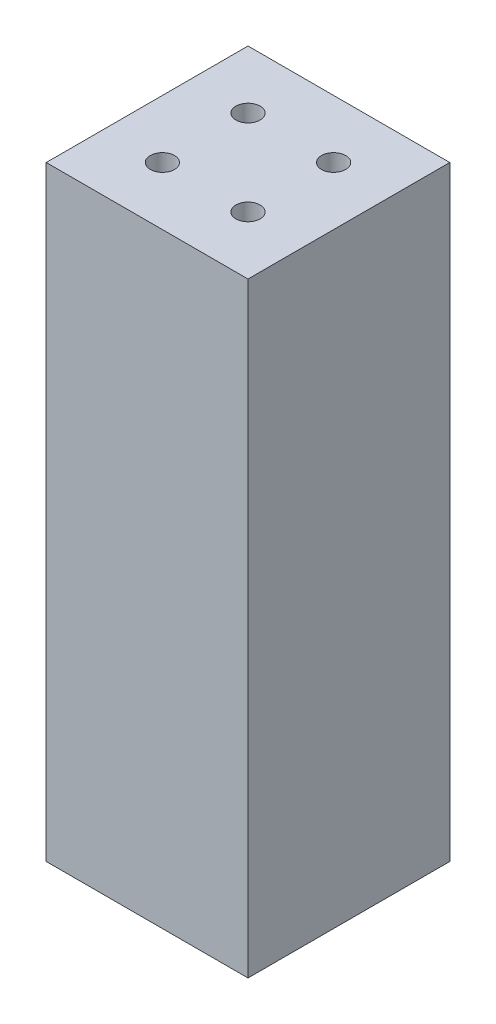
ISO-10303-21;
HEADER;
FILE_DESCRIPTION(('STEP AP214'),'2;1');
FILE_NAME('part.step','',(''),(''),'','','');
FILE_SCHEMA(('AUTOMOTIVE_DESIGN { 1 0 10303 214 1 1 1 1 }'));
ENDSEC;
DATA;
#1=APPLICATION_CONTEXT('core data for automotive mechanical design processes');
#2=APPLICATION_PROTOCOL_DEFINITION('international standard','automotive_design',2000,#1);
#3=PRODUCT_CONTEXT('',#1,'mechanical');
#4=PRODUCT('Part','Part','',(#3));
#5=PRODUCT_RELATED_PRODUCT_CATEGORY('part','',(#4));
#6=PRODUCT_DEFINITION_FORMATION('','',#4);
#7=PRODUCT_DEFINITION_CONTEXT('part definition',#1,'design');
#8=PRODUCT_DEFINITION('design','',#6,#7);
#9=PRODUCT_DEFINITION_SHAPE('','',#8);
#10=(LENGTH_UNIT() NAMED_UNIT(*) SI_UNIT(.MILLI.,.METRE.));
#11=(NAMED_UNIT(*) PLANE_ANGLE_UNIT() SI_UNIT($,.RADIAN.));
#12=(NAMED_UNIT(*) SI_UNIT($,.STERADIAN.) SOLID_ANGLE_UNIT());
#13=UNCERTAINTY_MEASURE_WITH_UNIT(LENGTH_MEASURE(1.E-05),#10,'distance_accuracy_value','');
#14=(GEOMETRIC_REPRESENTATION_CONTEXT(3) GLOBAL_UNCERTAINTY_ASSIGNED_CONTEXT((#13)) GLOBAL_UNIT_ASSIGNED_CONTEXT((#10,
#11,#12)) REPRESENTATION_CONTEXT('',''));
#15=CARTESIAN_POINT('',(0.,0.,0.));
#16=DIRECTION('',(0.,0.,1.));
#17=DIRECTION('',(1.,0.,0.));
#18=AXIS2_PLACEMENT_3D('',#15,#16,#17);
#19=CARTESIAN_POINT('',(-12.5,75.,-12.5));
#20=DIRECTION('',(1.,0.,0.));
#21=DIRECTION('',(0.,0.,-1.));
#22=AXIS2_PLACEMENT_3D('',#19,#20,#21);
#23=PLANE('',#22);
#24=DIRECTION('',(0.,0.,1.));
#25=VECTOR('',#24,1.);
#26=CARTESIAN_POINT('',(-12.5,0.,-12.5));
#27=LINE('',#26,#25);
#28=CARTESIAN_POINT('',(-12.5,0.,-12.5));
#29=VERTEX_POINT('',#28);
#30=CARTESIAN_POINT('',(-12.5,0.,12.5));
#31=VERTEX_POINT('',#30);
#32=EDGE_CURVE('E134',#29,#31,#27,.T.);
#33=ORIENTED_EDGE('',*,*,#32,.T.);
#34=DIRECTION('',(0.,-1.,0.));
#35=VECTOR('',#34,1.);
#36=CARTESIAN_POINT('',(-12.5,75.,12.5));
#37=LINE('',#36,#35);
#38=CARTESIAN_POINT('',(-12.5,75.,12.5));
#39=VERTEX_POINT('',#38);
#40=EDGE_CURVE('E11',#39,#31,#37,.T.);
#41=ORIENTED_EDGE('',*,*,#40,.F.);
#42=DIRECTION('',(0.,0.,1.));
#43=VECTOR('',#42,1.);
#44=CARTESIAN_POINT('',(-12.5,75.,-12.5));
#45=LINE('',#44,#43);
#46=CARTESIAN_POINT('',(-12.5,75.,-12.5));
#47=VERTEX_POINT('',#46);
#48=EDGE_CURVE('E135',#47,#39,#45,.T.);
#49=ORIENTED_EDGE('',*,*,#48,.F.);
#50=DIRECTION('',(0.,-1.,0.));
#51=VECTOR('',#50,1.);
#52=CARTESIAN_POINT('',(-12.5,75.,-12.5));
#53=LINE('',#52,#51);
#54=EDGE_CURVE('E141',#47,#29,#53,.T.);
#55=ORIENTED_EDGE('',*,*,#54,.T.);
#56=EDGE_LOOP('',(#33,#41,#49,#55));
#57=FACE_BOUND('',#56,.T.);
#58=ADVANCED_FACE('F41',(#57),#23,.F.);
#59=CARTESIAN_POINT('',(12.5,75.,12.5));
#60=DIRECTION('',(0.,0.,-1.));
#61=DIRECTION('',(-1.,0.,0.));
#62=AXIS2_PLACEMENT_3D('',#59,#60,#61);
#63=PLANE('',#62);
#64=DIRECTION('',(1.,0.,0.));
#65=VECTOR('',#64,1.);
#66=CARTESIAN_POINT('',(12.5,0.,12.5));
#67=LINE('',#66,#65);
#68=CARTESIAN_POINT('',(12.5,0.,12.5));
#69=VERTEX_POINT('',#68);
#70=EDGE_CURVE('E144',#31,#69,#67,.T.);
#71=ORIENTED_EDGE('',*,*,#70,.T.);
#72=DIRECTION('',(0.,-1.,0.));
#73=VECTOR('',#72,1.);
#74=CARTESIAN_POINT('',(12.5,75.,12.5));
#75=LINE('',#74,#73);
#76=CARTESIAN_POINT('',(12.5,75.,12.5));
#77=VERTEX_POINT('',#76);
#78=EDGE_CURVE('E49',#77,#69,#75,.T.);
#79=ORIENTED_EDGE('',*,*,#78,.F.);
#80=DIRECTION('',(1.,0.,0.));
#81=VECTOR('',#80,1.);
#82=CARTESIAN_POINT('',(12.5,75.,12.5));
#83=LINE('',#82,#81);
#84=EDGE_CURVE('E88',#39,#77,#83,.T.);
#85=ORIENTED_EDGE('',*,*,#84,.F.);
#86=ORIENTED_EDGE('',*,*,#40,.T.);
#87=EDGE_LOOP('',(#71,#79,#85,#86));
#88=FACE_BOUND('',#87,.T.);
#89=ADVANCED_FACE('F168',(#88),#63,.F.);
#90=CARTESIAN_POINT('',(12.5,75.,-12.5));
#91=DIRECTION('',(-1.,0.,0.));
#92=DIRECTION('',(0.,0.,1.));
#93=AXIS2_PLACEMENT_3D('',#90,#91,#92);
#94=PLANE('',#93);
#95=DIRECTION('',(0.,0.,-1.));
#96=VECTOR('',#95,1.);
#97=CARTESIAN_POINT('',(12.5,0.,-12.5));
#98=LINE('',#97,#96);
#99=CARTESIAN_POINT('',(12.5,0.,-12.5));
#100=VERTEX_POINT('',#99);
#101=EDGE_CURVE('E75',#69,#100,#98,.T.);
#102=ORIENTED_EDGE('',*,*,#101,.T.);
#103=DIRECTION('',(0.,-1.,0.));
#104=VECTOR('',#103,1.);
#105=CARTESIAN_POINT('',(12.5,75.,-12.5));
#106=LINE('',#105,#104);
#107=CARTESIAN_POINT('',(12.5,75.,-12.5));
#108=VERTEX_POINT('',#107);
#109=EDGE_CURVE('E149',#108,#100,#106,.T.);
#110=ORIENTED_EDGE('',*,*,#109,.F.);
#111=DIRECTION('',(0.,0.,-1.));
#112=VECTOR('',#111,1.);
#113=CARTESIAN_POINT('',(12.5,75.,-12.5));
#114=LINE('',#113,#112);
#115=EDGE_CURVE('E138',#77,#108,#114,.T.);
#116=ORIENTED_EDGE('',*,*,#115,.F.);
#117=ORIENTED_EDGE('',*,*,#78,.T.);
#118=EDGE_LOOP('',(#102,#110,#116,#117));
#119=FACE_BOUND('',#118,.T.);
#120=ADVANCED_FACE('F151',(#119),#94,.F.);
#121=CARTESIAN_POINT('',(12.5,75.,-12.5));
#122=DIRECTION('',(0.,0.,1.));
#123=DIRECTION('',(1.,0.,0.));
#124=AXIS2_PLACEMENT_3D('',#121,#122,#123);
#125=PLANE('',#124);
#126=DIRECTION('',(-1.,0.,0.));
#127=VECTOR('',#126,1.);
#128=CARTESIAN_POINT('',(12.5,0.,-12.5));
#129=LINE('',#128,#127);
#130=EDGE_CURVE('E81',#100,#29,#129,.T.);
#131=ORIENTED_EDGE('',*,*,#130,.T.);
#132=ORIENTED_EDGE('',*,*,#54,.F.);
#133=DIRECTION('',(-1.,0.,0.));
#134=VECTOR('',#133,1.);
#135=CARTESIAN_POINT('',(12.5,75.,-12.5));
#136=LINE('',#135,#134);
#137=EDGE_CURVE('E57',#108,#47,#136,.T.);
#138=ORIENTED_EDGE('',*,*,#137,.F.);
#139=ORIENTED_EDGE('',*,*,#109,.T.);
#140=EDGE_LOOP('',(#131,#132,#138,#139));
#141=FACE_BOUND('',#140,.T.);
#142=ADVANCED_FACE('F158',(#141),#125,.F.);
#143=CARTESIAN_POINT('',(0.,75.,0.));
#144=DIRECTION('',(0.,-1.,0.));
#145=DIRECTION('',(0.,0.,-1.));
#146=AXIS2_PLACEMENT_3D('',#143,#144,#145);
#147=PLANE('',#146);
#148=CARTESIAN_POINT('',(-5.30330085889909,75.,5.30330085889912));
#149=DIRECTION('',(0.,1.,0.));
#150=DIRECTION('',(0.,0.,1.));
#151=AXIS2_PLACEMENT_3D('',#148,#149,#150);
#152=CIRCLE('',#151,1.5);
#153=CARTESIAN_POINT('',(-5.30330085889909,75.,6.80330085889911));
#154=VERTEX_POINT('',#153);
#155=EDGE_CURVE('E112',#154,#154,#152,.T.);
#156=ORIENTED_EDGE('',*,*,#155,.F.);
#157=EDGE_LOOP('',(#156));
#158=FACE_BOUND('',#157,.T.);
#159=CARTESIAN_POINT('',(5.30330085889912,75.,5.30330085889909));
#160=DIRECTION('',(0.,1.,0.));
#161=DIRECTION('',(0.,0.,1.));
#162=AXIS2_PLACEMENT_3D('',#159,#160,#161);
#163=CIRCLE('',#162,1.5);
#164=CARTESIAN_POINT('',(5.30330085889912,75.,6.80330085889909));
#165=VERTEX_POINT('',#164);
#166=EDGE_CURVE('E111',#165,#165,#163,.T.);
#167=ORIENTED_EDGE('',*,*,#166,.F.);
#168=EDGE_LOOP('',(#167));
#169=FACE_BOUND('',#168,.T.);
#170=CARTESIAN_POINT('',(5.3033008588991,75.,-5.30330085889912));
#171=DIRECTION('',(0.,1.,0.));
#172=DIRECTION('',(0.,0.,1.));
#173=AXIS2_PLACEMENT_3D('',#170,#171,#172);
#174=CIRCLE('',#173,1.5);
#175=CARTESIAN_POINT('',(5.3033008588991,75.,-3.80330085889912));
#176=VERTEX_POINT('',#175);
#177=EDGE_CURVE('E122',#176,#176,#174,.T.);
#178=ORIENTED_EDGE('',*,*,#177,.F.);
#179=EDGE_LOOP('',(#178));
#180=FACE_BOUND('',#179,.T.);
#181=CARTESIAN_POINT('',(-5.30330085889912,75.,-5.30330085889909));
#182=DIRECTION('',(0.,1.,0.));
#183=DIRECTION('',(0.,0.,1.));
#184=AXIS2_PLACEMENT_3D('',#181,#182,#183);
#185=CIRCLE('',#184,1.5);
#186=CARTESIAN_POINT('',(-5.30330085889912,75.,-3.8033008588991));
#187=VERTEX_POINT('',#186);
#188=EDGE_CURVE('E128',#187,#187,#185,.T.);
#189=ORIENTED_EDGE('',*,*,#188,.F.);
#190=EDGE_LOOP('',(#189));
#191=FACE_BOUND('',#190,.T.);
#192=ORIENTED_EDGE('',*,*,#48,.T.);
#193=ORIENTED_EDGE('',*,*,#84,.T.);
#194=ORIENTED_EDGE('',*,*,#115,.T.);
#195=ORIENTED_EDGE('',*,*,#137,.T.);
#196=EDGE_LOOP('',(#192,#193,#194,#195));
#197=FACE_BOUND('',#196,.T.);
#198=ADVANCED_FACE('F160',(#158,#169,#180,#191,#197),#147,.F.);
#199=CARTESIAN_POINT('',(0.,0.,0.));
#200=DIRECTION('',(0.,-1.,0.));
#201=DIRECTION('',(0.,0.,-1.));
#202=AXIS2_PLACEMENT_3D('',#199,#200,#201);
#203=PLANE('',#202);
#204=ORIENTED_EDGE('',*,*,#32,.F.);
#205=ORIENTED_EDGE('',*,*,#130,.F.);
#206=ORIENTED_EDGE('',*,*,#101,.F.);
#207=ORIENTED_EDGE('',*,*,#70,.F.);
#208=EDGE_LOOP('',(#204,#205,#206,#207));
#209=FACE_BOUND('',#208,.T.);
#210=ADVANCED_FACE('F154',(#209),#203,.T.);
#211=CARTESIAN_POINT('',(-5.30330085889912,40.,-5.30330085889909));
#212=DIRECTION('',(0.,1.,0.));
#213=DIRECTION('',(0.,0.,1.));
#214=AXIS2_PLACEMENT_3D('',#211,#212,#213);
#215=CONICAL_SURFACE('',#214,1.49999999999999,1.02974425867665);
#216=CARTESIAN_POINT('',(-5.30330085889913,39.0987090714587,-5.30330085889909));
#217=VERTEX_POINT('',#216);
#218=VERTEX_LOOP('',#217);
#219=FACE_BOUND('',#218,.T.);
#220=CARTESIAN_POINT('',(-5.30330085889912,40.,-5.30330085889909));
#221=DIRECTION('',(0.,1.,0.));
#222=DIRECTION('',(0.,0.,1.));
#223=AXIS2_PLACEMENT_3D('',#220,#221,#222);
#224=CIRCLE('',#223,1.49999999999999);
#225=CARTESIAN_POINT('',(-5.30330085889912,40.,-3.8033008588991));
#226=VERTEX_POINT('',#225);
#227=EDGE_CURVE('E131',#226,#226,#224,.T.);
#228=ORIENTED_EDGE('',*,*,#227,.T.);
#229=EDGE_LOOP('',(#228));
#230=FACE_BOUND('',#229,.T.);
#231=ADVANCED_FACE('F195',(#219,#230),#215,.F.);
#232=CARTESIAN_POINT('',(-5.30330085889912,75.,-5.30330085889909));
#233=DIRECTION('',(0.,1.,0.));
#234=DIRECTION('',(0.,0.,1.));
#235=AXIS2_PLACEMENT_3D('',#232,#233,#234);
#236=CYLINDRICAL_SURFACE('',#235,1.49999999999999);
#237=ORIENTED_EDGE('',*,*,#227,.F.);
#238=EDGE_LOOP('',(#237));
#239=FACE_BOUND('',#238,.T.);
#240=ORIENTED_EDGE('',*,*,#188,.T.);
#241=EDGE_LOOP('',(#240));
#242=FACE_BOUND('',#241,.T.);
#243=ADVANCED_FACE('F208',(#239,#242),#236,.F.);
#244=CARTESIAN_POINT('',(5.3033008588991,40.,-5.30330085889912));
#245=DIRECTION('',(0.,1.,0.));
#246=DIRECTION('',(0.,0.,1.));
#247=AXIS2_PLACEMENT_3D('',#244,#245,#246);
#248=CONICAL_SURFACE('',#247,1.49999999999999,1.02974425867665);
#249=CARTESIAN_POINT('',(5.30330085889909,39.0987090714587,-5.30330085889912));
#250=VERTEX_POINT('',#249);
#251=VERTEX_LOOP('',#250);
#252=FACE_BOUND('',#251,.T.);
#253=CARTESIAN_POINT('',(5.3033008588991,40.,-5.30330085889912));
#254=DIRECTION('',(0.,1.,0.));
#255=DIRECTION('',(0.,0.,1.));
#256=AXIS2_PLACEMENT_3D('',#253,#254,#255);
#257=CIRCLE('',#256,1.49999999999999);
#258=CARTESIAN_POINT('',(5.3033008588991,40.,-3.80330085889913));
#259=VERTEX_POINT('',#258);
#260=EDGE_CURVE('E125',#259,#259,#257,.T.);
#261=ORIENTED_EDGE('',*,*,#260,.T.);
#262=EDGE_LOOP('',(#261));
#263=FACE_BOUND('',#262,.T.);
#264=ADVANCED_FACE('F219',(#252,#263),#248,.F.);
#265=CARTESIAN_POINT('',(5.3033008588991,75.,-5.30330085889912));
#266=DIRECTION('',(0.,1.,0.));
#267=DIRECTION('',(0.,0.,1.));
#268=AXIS2_PLACEMENT_3D('',#265,#266,#267);
#269=CYLINDRICAL_SURFACE('',#268,1.49999999999999);
#270=ORIENTED_EDGE('',*,*,#260,.F.);
#271=EDGE_LOOP('',(#270));
#272=FACE_BOUND('',#271,.T.);
#273=ORIENTED_EDGE('',*,*,#177,.T.);
#274=EDGE_LOOP('',(#273));
#275=FACE_BOUND('',#274,.T.);
#276=ADVANCED_FACE('F231',(#272,#275),#269,.F.);
#277=CARTESIAN_POINT('',(5.30330085889912,40.,5.30330085889909));
#278=DIRECTION('',(0.,1.,0.));
#279=DIRECTION('',(0.,0.,1.));
#280=AXIS2_PLACEMENT_3D('',#277,#278,#279);
#281=CONICAL_SURFACE('',#280,1.49999999999999,1.02974425867665);
#282=CARTESIAN_POINT('',(5.30330085889911,39.0987090714587,5.30330085889909));
#283=VERTEX_POINT('',#282);
#284=VERTEX_LOOP('',#283);
#285=FACE_BOUND('',#284,.T.);
#286=CARTESIAN_POINT('',(5.30330085889912,40.,5.30330085889909));
#287=DIRECTION('',(0.,1.,0.));
#288=DIRECTION('',(0.,0.,1.));
#289=AXIS2_PLACEMENT_3D('',#286,#287,#288);
#290=CIRCLE('',#289,1.49999999999999);
#291=CARTESIAN_POINT('',(5.30330085889912,40.,6.80330085889909));
#292=VERTEX_POINT('',#291);
#293=EDGE_CURVE('E115',#292,#292,#290,.T.);
#294=ORIENTED_EDGE('',*,*,#293,.T.);
#295=EDGE_LOOP('',(#294));
#296=FACE_BOUND('',#295,.T.);
#297=ADVANCED_FACE('F241',(#285,#296),#281,.F.);
#298=CARTESIAN_POINT('',(5.30330085889912,75.,5.30330085889909));
#299=DIRECTION('',(0.,1.,0.));
#300=DIRECTION('',(0.,0.,1.));
#301=AXIS2_PLACEMENT_3D('',#298,#299,#300);
#302=CYLINDRICAL_SURFACE('',#301,1.49999999999999);
#303=ORIENTED_EDGE('',*,*,#293,.F.);
#304=EDGE_LOOP('',(#303));
#305=FACE_BOUND('',#304,.T.);
#306=ORIENTED_EDGE('',*,*,#166,.T.);
#307=EDGE_LOOP('',(#306));
#308=FACE_BOUND('',#307,.T.);
#309=ADVANCED_FACE('F105',(#305,#308),#302,.F.);
#310=CARTESIAN_POINT('',(-5.30330085889909,40.,5.30330085889912));
#311=DIRECTION('',(0.,1.,0.));
#312=DIRECTION('',(0.,0.,1.));
#313=AXIS2_PLACEMENT_3D('',#310,#311,#312);
#314=CONICAL_SURFACE('',#313,1.49999999999999,1.02974425867665);
#315=CARTESIAN_POINT('',(-5.3033008588991,39.0987090714587,5.30330085889912));
#316=VERTEX_POINT('',#315);
#317=VERTEX_LOOP('',#316);
#318=FACE_BOUND('',#317,.T.);
#319=CARTESIAN_POINT('',(-5.30330085889909,40.,5.30330085889912));
#320=DIRECTION('',(0.,1.,0.));
#321=DIRECTION('',(0.,0.,1.));
#322=AXIS2_PLACEMENT_3D('',#319,#320,#321);
#323=CIRCLE('',#322,1.49999999999999);
#324=CARTESIAN_POINT('',(-5.30330085889909,40.,6.80330085889911));
#325=VERTEX_POINT('',#324);
#326=EDGE_CURVE('E109',#325,#325,#323,.T.);
#327=ORIENTED_EDGE('',*,*,#326,.T.);
#328=EDGE_LOOP('',(#327));
#329=FACE_BOUND('',#328,.T.);
#330=ADVANCED_FACE('F101',(#318,#329),#314,.F.);
#331=CARTESIAN_POINT('',(-5.30330085889909,75.,5.30330085889912));
#332=DIRECTION('',(0.,1.,0.));
#333=DIRECTION('',(0.,0.,1.));
#334=AXIS2_PLACEMENT_3D('',#331,#332,#333);
#335=CYLINDRICAL_SURFACE('',#334,1.49999999999999);
#336=ORIENTED_EDGE('',*,*,#326,.F.);
#337=EDGE_LOOP('',(#336));
#338=FACE_BOUND('',#337,.T.);
#339=ORIENTED_EDGE('',*,*,#155,.T.);
#340=EDGE_LOOP('',(#339));
#341=FACE_BOUND('',#340,.T.);
#342=ADVANCED_FACE('F104',(#338,#341),#335,.F.);
#343=CLOSED_SHELL('',(#58,#89,#120,#142,#198,#210,#231,#243,#264,#276,#297,#309,#330,#342));
#344=MANIFOLD_SOLID_BREP('B2',#343);
#345=ADVANCED_BREP_SHAPE_REPRESENTATION('',(#18,#344),#14);
#346=SHAPE_DEFINITION_REPRESENTATION(#9,#345);
ENDSEC;
END-ISO-10303-21;
